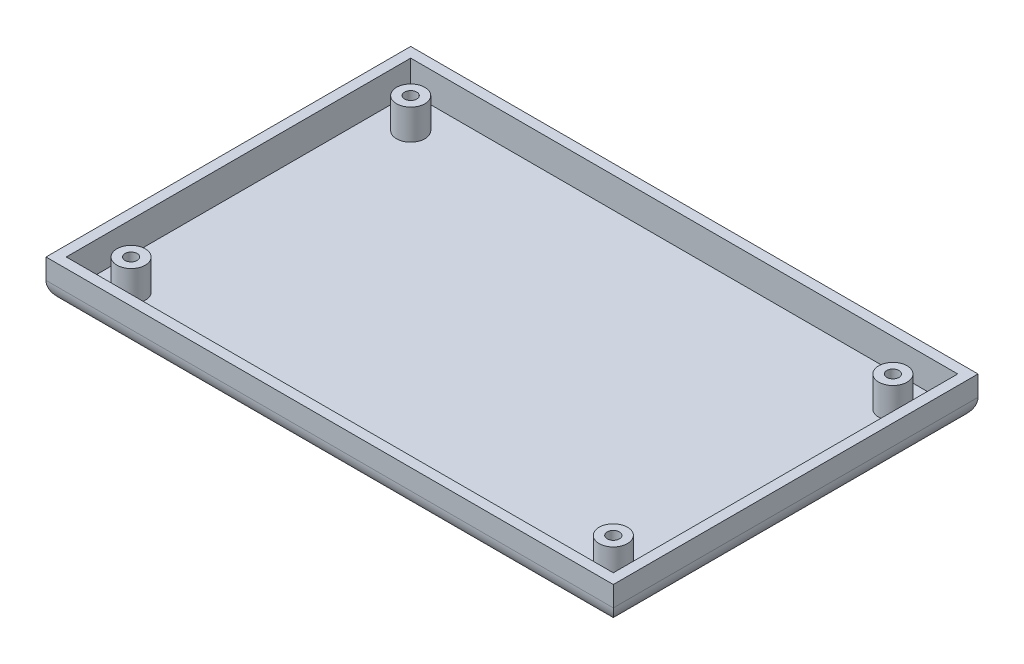
ISO-10303-21;
HEADER;
FILE_DESCRIPTION(('STEP AP214'),'2;1');
FILE_NAME('part.step','',(''),(''),'','','');
FILE_SCHEMA(('AUTOMOTIVE_DESIGN { 1 0 10303 214 1 1 1 1 }'));
ENDSEC;
DATA;
#1=APPLICATION_CONTEXT('core data for automotive mechanical design processes');
#2=APPLICATION_PROTOCOL_DEFINITION('international standard','automotive_design',2000,#1);
#3=PRODUCT_CONTEXT('',#1,'mechanical');
#4=PRODUCT('Part','Part','',(#3));
#5=PRODUCT_RELATED_PRODUCT_CATEGORY('part','',(#4));
#6=PRODUCT_DEFINITION_FORMATION('','',#4);
#7=PRODUCT_DEFINITION_CONTEXT('part definition',#1,'design');
#8=PRODUCT_DEFINITION('design','',#6,#7);
#9=PRODUCT_DEFINITION_SHAPE('','',#8);
#10=(LENGTH_UNIT() NAMED_UNIT(*) SI_UNIT(.MILLI.,.METRE.));
#11=(NAMED_UNIT(*) PLANE_ANGLE_UNIT() SI_UNIT($,.RADIAN.));
#12=(NAMED_UNIT(*) SI_UNIT($,.STERADIAN.) SOLID_ANGLE_UNIT());
#13=UNCERTAINTY_MEASURE_WITH_UNIT(LENGTH_MEASURE(1.E-05),#10,'distance_accuracy_value','');
#14=(GEOMETRIC_REPRESENTATION_CONTEXT(3) GLOBAL_UNCERTAINTY_ASSIGNED_CONTEXT((#13)) GLOBAL_UNIT_ASSIGNED_CONTEXT((#10,
#11,#12)) REPRESENTATION_CONTEXT('',''));
#15=CARTESIAN_POINT('',(0.,0.,0.));
#16=DIRECTION('',(0.,0.,1.));
#17=DIRECTION('',(1.,0.,0.));
#18=AXIS2_PLACEMENT_3D('',#15,#16,#17);
#19=CARTESIAN_POINT('',(0.,10.,0.));
#20=DIRECTION('',(1.,0.,0.));
#21=DIRECTION('',(0.,0.,-1.));
#22=AXIS2_PLACEMENT_3D('',#19,#20,#21);
#23=PLANE('',#22);
#24=DIRECTION('',(0.,-1.,0.));
#25=VECTOR('',#24,1.);
#26=CARTESIAN_POINT('',(0.,10.,-90.));
#27=LINE('',#26,#25);
#28=CARTESIAN_POINT('',(0.,10.,-90.));
#29=VERTEX_POINT('',#28);
#30=CARTESIAN_POINT('',(0.,5.,-90.));
#31=VERTEX_POINT('',#30);
#32=EDGE_CURVE('E226',#29,#31,#27,.T.);
#33=ORIENTED_EDGE('',*,*,#32,.T.);
#34=DIRECTION('',(0.,0.,1.));
#35=VECTOR('',#34,1.);
#36=CARTESIAN_POINT('',(0.,5.,0.));
#37=LINE('',#36,#35);
#38=CARTESIAN_POINT('',(0.,5.,0.));
#39=VERTEX_POINT('',#38);
#40=EDGE_CURVE('E101',#31,#39,#37,.T.);
#41=ORIENTED_EDGE('',*,*,#40,.T.);
#42=DIRECTION('',(0.,-1.,0.));
#43=VECTOR('',#42,1.);
#44=CARTESIAN_POINT('',(0.,10.,0.));
#45=LINE('',#44,#43);
#46=CARTESIAN_POINT('',(0.,10.,0.));
#47=VERTEX_POINT('',#46);
#48=EDGE_CURVE('E233',#47,#39,#45,.T.);
#49=ORIENTED_EDGE('',*,*,#48,.F.);
#50=DIRECTION('',(0.,0.,1.));
#51=VECTOR('',#50,1.);
#52=CARTESIAN_POINT('',(0.,10.,0.));
#53=LINE('',#52,#51);
#54=EDGE_CURVE('E214',#29,#47,#53,.T.);
#55=ORIENTED_EDGE('',*,*,#54,.F.);
#56=EDGE_LOOP('',(#33,#41,#49,#55));
#57=FACE_BOUND('',#56,.T.);
#58=ADVANCED_FACE('F92',(#57),#23,.F.);
#59=CARTESIAN_POINT('',(0.,10.,0.));
#60=DIRECTION('',(0.,0.,-1.));
#61=DIRECTION('',(-1.,0.,0.));
#62=AXIS2_PLACEMENT_3D('',#59,#60,#61);
#63=PLANE('',#62);
#64=ORIENTED_EDGE('',*,*,#48,.T.);
#65=DIRECTION('',(1.,0.,0.));
#66=VECTOR('',#65,1.);
#67=CARTESIAN_POINT('',(140.,5.,0.));
#68=LINE('',#67,#66);
#69=CARTESIAN_POINT('',(140.,5.,0.));
#70=VERTEX_POINT('',#69);
#71=EDGE_CURVE('E247',#39,#70,#68,.T.);
#72=ORIENTED_EDGE('',*,*,#71,.T.);
#73=DIRECTION('',(0.,-1.,0.));
#74=VECTOR('',#73,1.);
#75=CARTESIAN_POINT('',(140.,10.,0.));
#76=LINE('',#75,#74);
#77=CARTESIAN_POINT('',(140.,10.,0.));
#78=VERTEX_POINT('',#77);
#79=EDGE_CURVE('E230',#78,#70,#76,.T.);
#80=ORIENTED_EDGE('',*,*,#79,.F.);
#81=DIRECTION('',(1.,0.,0.));
#82=VECTOR('',#81,1.);
#83=CARTESIAN_POINT('',(0.,10.,0.));
#84=LINE('',#83,#82);
#85=EDGE_CURVE('E220',#47,#78,#84,.T.);
#86=ORIENTED_EDGE('',*,*,#85,.F.);
#87=EDGE_LOOP('',(#64,#72,#80,#86));
#88=FACE_BOUND('',#87,.T.);
#89=ADVANCED_FACE('F322',(#88),#63,.F.);
#90=CARTESIAN_POINT('',(140.,10.,0.));
#91=DIRECTION('',(-1.,0.,0.));
#92=DIRECTION('',(0.,0.,1.));
#93=AXIS2_PLACEMENT_3D('',#90,#91,#92);
#94=PLANE('',#93);
#95=ORIENTED_EDGE('',*,*,#79,.T.);
#96=DIRECTION('',(0.,0.,-1.));
#97=VECTOR('',#96,1.);
#98=CARTESIAN_POINT('',(140.,5.,-90.));
#99=LINE('',#98,#97);
#100=CARTESIAN_POINT('',(140.,5.,-90.));
#101=VERTEX_POINT('',#100);
#102=EDGE_CURVE('E235',#70,#101,#99,.T.);
#103=ORIENTED_EDGE('',*,*,#102,.T.);
#104=DIRECTION('',(0.,-1.,0.));
#105=VECTOR('',#104,1.);
#106=CARTESIAN_POINT('',(140.,10.,-90.));
#107=LINE('',#106,#105);
#108=CARTESIAN_POINT('',(140.,10.,-90.));
#109=VERTEX_POINT('',#108);
#110=EDGE_CURVE('E228',#109,#101,#107,.T.);
#111=ORIENTED_EDGE('',*,*,#110,.F.);
#112=DIRECTION('',(0.,0.,-1.));
#113=VECTOR('',#112,1.);
#114=CARTESIAN_POINT('',(140.,10.,0.));
#115=LINE('',#114,#113);
#116=EDGE_CURVE('E222',#78,#109,#115,.T.);
#117=ORIENTED_EDGE('',*,*,#116,.F.);
#118=EDGE_LOOP('',(#95,#103,#111,#117));
#119=FACE_BOUND('',#118,.T.);
#120=ADVANCED_FACE('F327',(#119),#94,.F.);
#121=CARTESIAN_POINT('',(0.,10.,-90.));
#122=DIRECTION('',(0.,0.,1.));
#123=DIRECTION('',(1.,0.,0.));
#124=AXIS2_PLACEMENT_3D('',#121,#122,#123);
#125=PLANE('',#124);
#126=ORIENTED_EDGE('',*,*,#110,.T.);
#127=DIRECTION('',(-1.,0.,0.));
#128=VECTOR('',#127,1.);
#129=CARTESIAN_POINT('',(0.,5.,-90.));
#130=LINE('',#129,#128);
#131=EDGE_CURVE('E12',#101,#31,#130,.T.);
#132=ORIENTED_EDGE('',*,*,#131,.T.);
#133=ORIENTED_EDGE('',*,*,#32,.F.);
#134=DIRECTION('',(-1.,0.,0.));
#135=VECTOR('',#134,1.);
#136=CARTESIAN_POINT('',(0.,10.,-90.));
#137=LINE('',#136,#135);
#138=EDGE_CURVE('E224',#109,#29,#137,.T.);
#139=ORIENTED_EDGE('',*,*,#138,.F.);
#140=EDGE_LOOP('',(#126,#132,#133,#139));
#141=FACE_BOUND('',#140,.T.);
#142=ADVANCED_FACE('F367',(#141),#125,.F.);
#143=CARTESIAN_POINT('',(0.,10.,0.));
#144=DIRECTION('',(0.,-1.,0.));
#145=DIRECTION('',(0.,0.,-1.));
#146=AXIS2_PLACEMENT_3D('',#143,#144,#145);
#147=PLANE('',#146);
#148=DIRECTION('',(-1.,0.,0.));
#149=VECTOR('',#148,1.);
#150=CARTESIAN_POINT('',(2.5,10.,-87.5));
#151=LINE('',#150,#149);
#152=CARTESIAN_POINT('',(137.5,10.,-87.5));
#153=VERTEX_POINT('',#152);
#154=CARTESIAN_POINT('',(2.5,10.,-87.5));
#155=VERTEX_POINT('',#154);
#156=EDGE_CURVE('E207',#153,#155,#151,.T.);
#157=ORIENTED_EDGE('',*,*,#156,.F.);
#158=DIRECTION('',(0.,0.,-1.));
#159=VECTOR('',#158,1.);
#160=CARTESIAN_POINT('',(137.5,10.,-87.5));
#161=LINE('',#160,#159);
#162=CARTESIAN_POINT('',(137.5,10.,-2.50000000000001));
#163=VERTEX_POINT('',#162);
#164=EDGE_CURVE('E178',#163,#153,#161,.T.);
#165=ORIENTED_EDGE('',*,*,#164,.F.);
#166=DIRECTION('',(1.,0.,0.));
#167=VECTOR('',#166,1.);
#168=CARTESIAN_POINT('',(2.5,10.,-2.50000000000001));
#169=LINE('',#168,#167);
#170=CARTESIAN_POINT('',(2.5,10.,-2.50000000000001));
#171=VERTEX_POINT('',#170);
#172=EDGE_CURVE('E195',#171,#163,#169,.T.);
#173=ORIENTED_EDGE('',*,*,#172,.F.);
#174=DIRECTION('',(0.,0.,1.));
#175=VECTOR('',#174,1.);
#176=CARTESIAN_POINT('',(2.5,10.,-87.5));
#177=LINE('',#176,#175);
#178=EDGE_CURVE('E198',#155,#171,#177,.T.);
#179=ORIENTED_EDGE('',*,*,#178,.F.);
#180=EDGE_LOOP('',(#157,#165,#173,#179));
#181=FACE_BOUND('',#180,.T.);
#182=ORIENTED_EDGE('',*,*,#54,.T.);
#183=ORIENTED_EDGE('',*,*,#85,.T.);
#184=ORIENTED_EDGE('',*,*,#116,.T.);
#185=ORIENTED_EDGE('',*,*,#138,.T.);
#186=EDGE_LOOP('',(#182,#183,#184,#185));
#187=FACE_BOUND('',#186,.T.);
#188=ADVANCED_FACE('F365',(#181,#187),#147,.F.);
#189=CARTESIAN_POINT('',(0.,0.,0.));
#190=DIRECTION('',(0.,-1.,0.));
#191=DIRECTION('',(0.,0.,-1.));
#192=AXIS2_PLACEMENT_3D('',#189,#190,#191);
#193=PLANE('',#192);
#194=DIRECTION('',(-1.,0.,0.));
#195=VECTOR('',#194,1.);
#196=CARTESIAN_POINT('',(140.,0.,-85.));
#197=LINE('',#196,#195);
#198=CARTESIAN_POINT('',(5.,0.,-85.));
#199=VERTEX_POINT('',#198);
#200=CARTESIAN_POINT('',(135.,0.,-85.));
#201=VERTEX_POINT('',#200);
#202=EDGE_CURVE('E238',#199,#201,#197,.F.);
#203=ORIENTED_EDGE('',*,*,#202,.T.);
#204=DIRECTION('',(0.,0.,-1.));
#205=VECTOR('',#204,1.);
#206=CARTESIAN_POINT('',(135.,0.,0.));
#207=LINE('',#206,#205);
#208=CARTESIAN_POINT('',(135.,0.,-5.));
#209=VERTEX_POINT('',#208);
#210=EDGE_CURVE('E244',#201,#209,#207,.F.);
#211=ORIENTED_EDGE('',*,*,#210,.T.);
#212=DIRECTION('',(1.,0.,0.));
#213=VECTOR('',#212,1.);
#214=CARTESIAN_POINT('',(0.,0.,-5.));
#215=LINE('',#214,#213);
#216=CARTESIAN_POINT('',(5.,0.,-5.));
#217=VERTEX_POINT('',#216);
#218=EDGE_CURVE('E242',#209,#217,#215,.F.);
#219=ORIENTED_EDGE('',*,*,#218,.T.);
#220=DIRECTION('',(0.,0.,1.));
#221=VECTOR('',#220,1.);
#222=CARTESIAN_POINT('',(5.,0.,-90.));
#223=LINE('',#222,#221);
#224=EDGE_CURVE('E240',#217,#199,#223,.F.);
#225=ORIENTED_EDGE('',*,*,#224,.T.);
#226=EDGE_LOOP('',(#203,#211,#219,#225));
#227=FACE_BOUND('',#226,.T.);
#228=CARTESIAN_POINT('',(129.5,0.,-10.5));
#229=DIRECTION('',(0.,1.,0.));
#230=DIRECTION('',(0.,0.,1.));
#231=AXIS2_PLACEMENT_3D('',#228,#229,#230);
#232=CIRCLE('',#231,1.49999999999997);
#233=CARTESIAN_POINT('',(129.5,0.,-9.00000000000004));
#234=VERTEX_POINT('',#233);
#235=EDGE_CURVE('E265',#234,#234,#232,.T.);
#236=ORIENTED_EDGE('',*,*,#235,.T.);
#237=EDGE_LOOP('',(#236));
#238=FACE_BOUND('',#237,.T.);
#239=CARTESIAN_POINT('',(129.5,0.,-79.5));
#240=DIRECTION('',(0.,1.,0.));
#241=DIRECTION('',(0.,0.,1.));
#242=AXIS2_PLACEMENT_3D('',#239,#240,#241);
#243=CIRCLE('',#242,1.49999999999997);
#244=CARTESIAN_POINT('',(129.5,0.,-78.));
#245=VERTEX_POINT('',#244);
#246=EDGE_CURVE('E592',#245,#245,#243,.T.);
#247=ORIENTED_EDGE('',*,*,#246,.T.);
#248=EDGE_LOOP('',(#247));
#249=FACE_BOUND('',#248,.T.);
#250=CARTESIAN_POINT('',(10.5,0.,-79.5));
#251=DIRECTION('',(0.,1.,0.));
#252=DIRECTION('',(0.,0.,1.));
#253=AXIS2_PLACEMENT_3D('',#250,#251,#252);
#254=CIRCLE('',#253,1.5);
#255=CARTESIAN_POINT('',(10.5,0.,-78.));
#256=VERTEX_POINT('',#255);
#257=EDGE_CURVE('E281',#256,#256,#254,.T.);
#258=ORIENTED_EDGE('',*,*,#257,.T.);
#259=EDGE_LOOP('',(#258));
#260=FACE_BOUND('',#259,.T.);
#261=CARTESIAN_POINT('',(10.5,0.,-10.5));
#262=DIRECTION('',(0.,1.,0.));
#263=DIRECTION('',(0.,0.,1.));
#264=AXIS2_PLACEMENT_3D('',#261,#262,#263);
#265=CIRCLE('',#264,1.5);
#266=CARTESIAN_POINT('',(10.5,0.,-9.00000000000001));
#267=VERTEX_POINT('',#266);
#268=EDGE_CURVE('E274',#267,#267,#265,.T.);
#269=ORIENTED_EDGE('',*,*,#268,.T.);
#270=EDGE_LOOP('',(#269));
#271=FACE_BOUND('',#270,.T.);
#272=ADVANCED_FACE('F355',(#227,#238,#249,#260,#271),#193,.T.);
#273=CARTESIAN_POINT('',(137.5,2.5,-87.5));
#274=DIRECTION('',(1.,0.,0.));
#275=DIRECTION('',(0.,0.,-1.));
#276=AXIS2_PLACEMENT_3D('',#273,#274,#275);
#277=PLANE('',#276);
#278=ORIENTED_EDGE('',*,*,#164,.T.);
#279=DIRECTION('',(0.,1.,0.));
#280=VECTOR('',#279,1.);
#281=CARTESIAN_POINT('',(137.5,2.5,-87.5));
#282=LINE('',#281,#280);
#283=CARTESIAN_POINT('',(137.5,2.5,-87.5));
#284=VERTEX_POINT('',#283);
#285=EDGE_CURVE('E171',#284,#153,#282,.T.);
#286=ORIENTED_EDGE('',*,*,#285,.F.);
#287=DIRECTION('',(0.,0.,-1.));
#288=VECTOR('',#287,1.);
#289=CARTESIAN_POINT('',(137.5,2.5,-87.5));
#290=LINE('',#289,#288);
#291=CARTESIAN_POINT('',(137.5,2.5,-2.50000000000001));
#292=VERTEX_POINT('',#291);
#293=EDGE_CURVE('E175',#292,#284,#290,.T.);
#294=ORIENTED_EDGE('',*,*,#293,.F.);
#295=DIRECTION('',(0.,1.,0.));
#296=VECTOR('',#295,1.);
#297=CARTESIAN_POINT('',(137.5,2.5,-2.50000000000001));
#298=LINE('',#297,#296);
#299=EDGE_CURVE('E212',#292,#163,#298,.T.);
#300=ORIENTED_EDGE('',*,*,#299,.T.);
#301=EDGE_LOOP('',(#278,#286,#294,#300));
#302=FACE_BOUND('',#301,.T.);
#303=ADVANCED_FACE('F173',(#302),#277,.F.);
#304=CARTESIAN_POINT('',(2.5,2.5,-2.50000000000001));
#305=DIRECTION('',(0.,0.,1.));
#306=DIRECTION('',(1.,0.,0.));
#307=AXIS2_PLACEMENT_3D('',#304,#305,#306);
#308=PLANE('',#307);
#309=ORIENTED_EDGE('',*,*,#172,.T.);
#310=ORIENTED_EDGE('',*,*,#299,.F.);
#311=DIRECTION('',(1.,0.,0.));
#312=VECTOR('',#311,1.);
#313=CARTESIAN_POINT('',(2.5,2.5,-2.50000000000001));
#314=LINE('',#313,#312);
#315=CARTESIAN_POINT('',(2.5,2.5,-2.50000000000001));
#316=VERTEX_POINT('',#315);
#317=EDGE_CURVE('E183',#316,#292,#314,.T.);
#318=ORIENTED_EDGE('',*,*,#317,.F.);
#319=DIRECTION('',(0.,1.,0.));
#320=VECTOR('',#319,1.);
#321=CARTESIAN_POINT('',(2.5,2.5,-2.50000000000001));
#322=LINE('',#321,#320);
#323=EDGE_CURVE('E215',#316,#171,#322,.T.);
#324=ORIENTED_EDGE('',*,*,#323,.T.);
#325=EDGE_LOOP('',(#309,#310,#318,#324));
#326=FACE_BOUND('',#325,.T.);
#327=ADVANCED_FACE('F380',(#326),#308,.F.);
#328=CARTESIAN_POINT('',(2.5,2.5,-87.5));
#329=DIRECTION('',(-1.,0.,0.));
#330=DIRECTION('',(0.,0.,1.));
#331=AXIS2_PLACEMENT_3D('',#328,#329,#330);
#332=PLANE('',#331);
#333=ORIENTED_EDGE('',*,*,#178,.T.);
#334=ORIENTED_EDGE('',*,*,#323,.F.);
#335=DIRECTION('',(0.,0.,1.));
#336=VECTOR('',#335,1.);
#337=CARTESIAN_POINT('',(2.5,2.5,-87.5));
#338=LINE('',#337,#336);
#339=CARTESIAN_POINT('',(2.5,2.5,-87.5));
#340=VERTEX_POINT('',#339);
#341=EDGE_CURVE('E191',#340,#316,#338,.T.);
#342=ORIENTED_EDGE('',*,*,#341,.F.);
#343=DIRECTION('',(0.,1.,0.));
#344=VECTOR('',#343,1.);
#345=CARTESIAN_POINT('',(2.5,2.5,-87.5));
#346=LINE('',#345,#344);
#347=EDGE_CURVE('E182',#340,#155,#346,.T.);
#348=ORIENTED_EDGE('',*,*,#347,.T.);
#349=EDGE_LOOP('',(#333,#334,#342,#348));
#350=FACE_BOUND('',#349,.T.);
#351=ADVANCED_FACE('F316',(#350),#332,.F.);
#352=CARTESIAN_POINT('',(2.5,2.5,-87.5));
#353=DIRECTION('',(0.,0.,-1.));
#354=DIRECTION('',(-1.,0.,0.));
#355=AXIS2_PLACEMENT_3D('',#352,#353,#354);
#356=PLANE('',#355);
#357=ORIENTED_EDGE('',*,*,#156,.T.);
#358=ORIENTED_EDGE('',*,*,#347,.F.);
#359=DIRECTION('',(-1.,0.,0.));
#360=VECTOR('',#359,1.);
#361=CARTESIAN_POINT('',(2.5,2.5,-87.5));
#362=LINE('',#361,#360);
#363=EDGE_CURVE('E186',#284,#340,#362,.T.);
#364=ORIENTED_EDGE('',*,*,#363,.F.);
#365=ORIENTED_EDGE('',*,*,#285,.T.);
#366=EDGE_LOOP('',(#357,#358,#364,#365));
#367=FACE_BOUND('',#366,.T.);
#368=ADVANCED_FACE('F187',(#367),#356,.F.);
#369=CARTESIAN_POINT('',(0.,2.5,0.));
#370=DIRECTION('',(0.,1.,0.));
#371=DIRECTION('',(0.,0.,1.));
#372=AXIS2_PLACEMENT_3D('',#369,#370,#371);
#373=PLANE('',#372);
#374=CARTESIAN_POINT('',(129.5,2.5,-79.5));
#375=DIRECTION('',(0.,1.,0.));
#376=DIRECTION('',(0.,0.,1.));
#377=AXIS2_PLACEMENT_3D('',#374,#375,#376);
#378=CIRCLE('',#377,3.49999999999999);
#379=CARTESIAN_POINT('',(129.5,2.5,-76.));
#380=VERTEX_POINT('',#379);
#381=EDGE_CURVE('E277',#380,#380,#378,.T.);
#382=ORIENTED_EDGE('',*,*,#381,.F.);
#383=EDGE_LOOP('',(#382));
#384=FACE_BOUND('',#383,.T.);
#385=CARTESIAN_POINT('',(129.5,2.5,-10.5));
#386=DIRECTION('',(0.,1.,0.));
#387=DIRECTION('',(0.,0.,1.));
#388=AXIS2_PLACEMENT_3D('',#385,#386,#387);
#389=CIRCLE('',#388,3.49999999999999);
#390=CARTESIAN_POINT('',(129.5,2.5,-7.00000000000002));
#391=VERTEX_POINT('',#390);
#392=EDGE_CURVE('E285',#391,#391,#389,.T.);
#393=ORIENTED_EDGE('',*,*,#392,.F.);
#394=EDGE_LOOP('',(#393));
#395=FACE_BOUND('',#394,.T.);
#396=CARTESIAN_POINT('',(10.5,2.5,-10.5));
#397=DIRECTION('',(0.,1.,0.));
#398=DIRECTION('',(0.,0.,1.));
#399=AXIS2_PLACEMENT_3D('',#396,#397,#398);
#400=CIRCLE('',#399,3.5);
#401=CARTESIAN_POINT('',(10.5,2.5,-7.00000000000001));
#402=VERTEX_POINT('',#401);
#403=EDGE_CURVE('E291',#402,#402,#400,.T.);
#404=ORIENTED_EDGE('',*,*,#403,.F.);
#405=EDGE_LOOP('',(#404));
#406=FACE_BOUND('',#405,.T.);
#407=CARTESIAN_POINT('',(10.5,2.5,-79.5));
#408=DIRECTION('',(0.,1.,0.));
#409=DIRECTION('',(0.,0.,1.));
#410=AXIS2_PLACEMENT_3D('',#407,#408,#409);
#411=CIRCLE('',#410,3.5);
#412=CARTESIAN_POINT('',(10.5,2.5,-76.));
#413=VERTEX_POINT('',#412);
#414=EDGE_CURVE('E201',#413,#413,#411,.T.);
#415=ORIENTED_EDGE('',*,*,#414,.F.);
#416=EDGE_LOOP('',(#415));
#417=FACE_BOUND('',#416,.T.);
#418=ORIENTED_EDGE('',*,*,#293,.T.);
#419=ORIENTED_EDGE('',*,*,#363,.T.);
#420=ORIENTED_EDGE('',*,*,#341,.T.);
#421=ORIENTED_EDGE('',*,*,#317,.T.);
#422=EDGE_LOOP('',(#418,#419,#420,#421));
#423=FACE_BOUND('',#422,.T.);
#424=ADVANCED_FACE('F193',(#384,#395,#406,#417,#423),#373,.T.);
#425=CARTESIAN_POINT('',(10.5,10.,-79.5));
#426=DIRECTION('',(0.,-1.,0.));
#427=DIRECTION('',(0.,0.,-1.));
#428=AXIS2_PLACEMENT_3D('',#425,#426,#427);
#429=CYLINDRICAL_SURFACE('',#428,3.5);
#430=CARTESIAN_POINT('',(10.5,10.,-79.5));
#431=DIRECTION('',(0.,1.,0.));
#432=DIRECTION('',(0.,0.,1.));
#433=AXIS2_PLACEMENT_3D('',#430,#431,#432);
#434=CIRCLE('',#433,3.5);
#435=CARTESIAN_POINT('',(10.5,10.,-76.));
#436=VERTEX_POINT('',#435);
#437=EDGE_CURVE('E208',#436,#436,#434,.T.);
#438=ORIENTED_EDGE('',*,*,#437,.F.);
#439=EDGE_LOOP('',(#438));
#440=FACE_BOUND('',#439,.T.);
#441=ORIENTED_EDGE('',*,*,#414,.T.);
#442=EDGE_LOOP('',(#441));
#443=FACE_BOUND('',#442,.T.);
#444=ADVANCED_FACE('F304',(#440,#443),#429,.T.);
#445=CARTESIAN_POINT('',(10.5,10.,-79.5));
#446=DIRECTION('',(0.,1.,0.));
#447=DIRECTION('',(0.,0.,1.));
#448=AXIS2_PLACEMENT_3D('',#445,#446,#447);
#449=PLANE('',#448);
#450=CARTESIAN_POINT('',(10.5,10.,-79.5));
#451=DIRECTION('',(0.,1.,0.));
#452=DIRECTION('',(0.,0.,1.));
#453=AXIS2_PLACEMENT_3D('',#450,#451,#452);
#454=CIRCLE('',#453,1.5);
#455=CARTESIAN_POINT('',(10.5,10.,-78.));
#456=VERTEX_POINT('',#455);
#457=EDGE_CURVE('E595',#456,#456,#454,.T.);
#458=ORIENTED_EDGE('',*,*,#457,.F.);
#459=EDGE_LOOP('',(#458));
#460=FACE_BOUND('',#459,.T.);
#461=ORIENTED_EDGE('',*,*,#437,.T.);
#462=EDGE_LOOP('',(#461));
#463=FACE_BOUND('',#462,.T.);
#464=ADVANCED_FACE('F313',(#460,#463),#449,.T.);
#465=CARTESIAN_POINT('',(10.5,10.,-10.5));
#466=DIRECTION('',(0.,-1.,0.));
#467=DIRECTION('',(0.,0.,-1.));
#468=AXIS2_PLACEMENT_3D('',#465,#466,#467);
#469=CYLINDRICAL_SURFACE('',#468,3.5);
#470=CARTESIAN_POINT('',(10.5,10.,-10.5));
#471=DIRECTION('',(0.,1.,0.));
#472=DIRECTION('',(0.,0.,1.));
#473=AXIS2_PLACEMENT_3D('',#470,#471,#472);
#474=CIRCLE('',#473,3.5);
#475=CARTESIAN_POINT('',(10.5,10.,-7.00000000000001));
#476=VERTEX_POINT('',#475);
#477=EDGE_CURVE('E294',#476,#476,#474,.T.);
#478=ORIENTED_EDGE('',*,*,#477,.F.);
#479=EDGE_LOOP('',(#478));
#480=FACE_BOUND('',#479,.T.);
#481=ORIENTED_EDGE('',*,*,#403,.T.);
#482=EDGE_LOOP('',(#481));
#483=FACE_BOUND('',#482,.T.);
#484=ADVANCED_FACE('F417',(#480,#483),#469,.T.);
#485=CARTESIAN_POINT('',(10.5,10.,-10.5));
#486=DIRECTION('',(0.,1.,0.));
#487=DIRECTION('',(0.,0.,1.));
#488=AXIS2_PLACEMENT_3D('',#485,#486,#487);
#489=PLANE('',#488);
#490=CARTESIAN_POINT('',(10.5,10.,-10.5));
#491=DIRECTION('',(0.,1.,0.));
#492=DIRECTION('',(0.,0.,1.));
#493=AXIS2_PLACEMENT_3D('',#490,#491,#492);
#494=CIRCLE('',#493,1.5);
#495=CARTESIAN_POINT('',(10.5,10.,-9.00000000000001));
#496=VERTEX_POINT('',#495);
#497=EDGE_CURVE('E278',#496,#496,#494,.T.);
#498=ORIENTED_EDGE('',*,*,#497,.F.);
#499=EDGE_LOOP('',(#498));
#500=FACE_BOUND('',#499,.T.);
#501=ORIENTED_EDGE('',*,*,#477,.T.);
#502=EDGE_LOOP('',(#501));
#503=FACE_BOUND('',#502,.T.);
#504=ADVANCED_FACE('F422',(#500,#503),#489,.T.);
#505=CARTESIAN_POINT('',(129.5,10.,-10.5));
#506=DIRECTION('',(0.,-1.,0.));
#507=DIRECTION('',(0.,0.,-1.));
#508=AXIS2_PLACEMENT_3D('',#505,#506,#507);
#509=CYLINDRICAL_SURFACE('',#508,3.49999999999999);
#510=CARTESIAN_POINT('',(129.5,10.,-10.5));
#511=DIRECTION('',(0.,1.,0.));
#512=DIRECTION('',(0.,0.,1.));
#513=AXIS2_PLACEMENT_3D('',#510,#511,#512);
#514=CIRCLE('',#513,3.49999999999999);
#515=CARTESIAN_POINT('',(129.5,10.,-7.00000000000002));
#516=VERTEX_POINT('',#515);
#517=EDGE_CURVE('E288',#516,#516,#514,.T.);
#518=ORIENTED_EDGE('',*,*,#517,.F.);
#519=EDGE_LOOP('',(#518));
#520=FACE_BOUND('',#519,.T.);
#521=ORIENTED_EDGE('',*,*,#392,.T.);
#522=EDGE_LOOP('',(#521));
#523=FACE_BOUND('',#522,.T.);
#524=ADVANCED_FACE('F430',(#520,#523),#509,.T.);
#525=CARTESIAN_POINT('',(129.5,10.,-10.5));
#526=DIRECTION('',(0.,1.,0.));
#527=DIRECTION('',(0.,0.,1.));
#528=AXIS2_PLACEMENT_3D('',#525,#526,#527);
#529=PLANE('',#528);
#530=CARTESIAN_POINT('',(129.5,10.,-10.5));
#531=DIRECTION('',(0.,1.,0.));
#532=DIRECTION('',(0.,0.,1.));
#533=AXIS2_PLACEMENT_3D('',#530,#531,#532);
#534=CIRCLE('',#533,1.49999999999997);
#535=CARTESIAN_POINT('',(129.5,10.,-9.00000000000004));
#536=VERTEX_POINT('',#535);
#537=EDGE_CURVE('E259',#536,#536,#534,.T.);
#538=ORIENTED_EDGE('',*,*,#537,.F.);
#539=EDGE_LOOP('',(#538));
#540=FACE_BOUND('',#539,.T.);
#541=ORIENTED_EDGE('',*,*,#517,.T.);
#542=EDGE_LOOP('',(#541));
#543=FACE_BOUND('',#542,.T.);
#544=ADVANCED_FACE('F435',(#540,#543),#529,.T.);
#545=CARTESIAN_POINT('',(129.5,10.,-79.5));
#546=DIRECTION('',(0.,-1.,0.));
#547=DIRECTION('',(0.,0.,-1.));
#548=AXIS2_PLACEMENT_3D('',#545,#546,#547);
#549=CYLINDRICAL_SURFACE('',#548,3.49999999999999);
#550=CARTESIAN_POINT('',(129.5,10.,-79.5));
#551=DIRECTION('',(0.,1.,0.));
#552=DIRECTION('',(0.,0.,1.));
#553=AXIS2_PLACEMENT_3D('',#550,#551,#552);
#554=CIRCLE('',#553,3.49999999999999);
#555=CARTESIAN_POINT('',(129.5,10.,-76.));
#556=VERTEX_POINT('',#555);
#557=EDGE_CURVE('E282',#556,#556,#554,.T.);
#558=ORIENTED_EDGE('',*,*,#557,.F.);
#559=EDGE_LOOP('',(#558));
#560=FACE_BOUND('',#559,.T.);
#561=ORIENTED_EDGE('',*,*,#381,.T.);
#562=EDGE_LOOP('',(#561));
#563=FACE_BOUND('',#562,.T.);
#564=ADVANCED_FACE('F443',(#560,#563),#549,.T.);
#565=CARTESIAN_POINT('',(129.5,10.,-79.5));
#566=DIRECTION('',(0.,1.,0.));
#567=DIRECTION('',(0.,0.,1.));
#568=AXIS2_PLACEMENT_3D('',#565,#566,#567);
#569=PLANE('',#568);
#570=CARTESIAN_POINT('',(129.5,10.,-79.5));
#571=DIRECTION('',(0.,1.,0.));
#572=DIRECTION('',(0.,0.,1.));
#573=AXIS2_PLACEMENT_3D('',#570,#571,#572);
#574=CIRCLE('',#573,1.49999999999997);
#575=CARTESIAN_POINT('',(129.5,10.,-78.));
#576=VERTEX_POINT('',#575);
#577=EDGE_CURVE('E270',#576,#576,#574,.T.);
#578=ORIENTED_EDGE('',*,*,#577,.F.);
#579=EDGE_LOOP('',(#578));
#580=FACE_BOUND('',#579,.T.);
#581=ORIENTED_EDGE('',*,*,#557,.T.);
#582=EDGE_LOOP('',(#581));
#583=FACE_BOUND('',#582,.T.);
#584=ADVANCED_FACE('F448',(#580,#583),#569,.T.);
#585=CARTESIAN_POINT('',(129.5,0.,-79.5));
#586=DIRECTION('',(0.,1.,0.));
#587=DIRECTION('',(0.,0.,1.));
#588=AXIS2_PLACEMENT_3D('',#585,#586,#587);
#589=CYLINDRICAL_SURFACE('',#588,1.49999999999997);
#590=ORIENTED_EDGE('',*,*,#246,.F.);
#591=EDGE_LOOP('',(#590));
#592=FACE_BOUND('',#591,.T.);
#593=ORIENTED_EDGE('',*,*,#577,.T.);
#594=EDGE_LOOP('',(#593));
#595=FACE_BOUND('',#594,.T.);
#596=ADVANCED_FACE('F479',(#592,#595),#589,.F.);
#597=CARTESIAN_POINT('',(129.5,0.,-10.5));
#598=DIRECTION('',(0.,1.,0.));
#599=DIRECTION('',(0.,0.,1.));
#600=AXIS2_PLACEMENT_3D('',#597,#598,#599);
#601=CYLINDRICAL_SURFACE('',#600,1.49999999999997);
#602=ORIENTED_EDGE('',*,*,#235,.F.);
#603=EDGE_LOOP('',(#602));
#604=FACE_BOUND('',#603,.T.);
#605=ORIENTED_EDGE('',*,*,#537,.T.);
#606=EDGE_LOOP('',(#605));
#607=FACE_BOUND('',#606,.T.);
#608=ADVANCED_FACE('F489',(#604,#607),#601,.F.);
#609=CARTESIAN_POINT('',(10.5,0.,-10.5));
#610=DIRECTION('',(0.,1.,0.));
#611=DIRECTION('',(0.,0.,1.));
#612=AXIS2_PLACEMENT_3D('',#609,#610,#611);
#613=CYLINDRICAL_SURFACE('',#612,1.5);
#614=ORIENTED_EDGE('',*,*,#268,.F.);
#615=EDGE_LOOP('',(#614));
#616=FACE_BOUND('',#615,.T.);
#617=ORIENTED_EDGE('',*,*,#497,.T.);
#618=EDGE_LOOP('',(#617));
#619=FACE_BOUND('',#618,.T.);
#620=ADVANCED_FACE('F348',(#616,#619),#613,.F.);
#621=CARTESIAN_POINT('',(10.5,0.,-79.5));
#622=DIRECTION('',(0.,1.,0.));
#623=DIRECTION('',(0.,0.,1.));
#624=AXIS2_PLACEMENT_3D('',#621,#622,#623);
#625=CYLINDRICAL_SURFACE('',#624,1.5);
#626=ORIENTED_EDGE('',*,*,#257,.F.);
#627=EDGE_LOOP('',(#626));
#628=FACE_BOUND('',#627,.T.);
#629=ORIENTED_EDGE('',*,*,#457,.T.);
#630=EDGE_LOOP('',(#629));
#631=FACE_BOUND('',#630,.T.);
#632=ADVANCED_FACE('F343',(#628,#631),#625,.F.);
#633=CARTESIAN_POINT('',(5.,5.,0.));
#634=DIRECTION('',(0.,0.,-1.));
#635=DIRECTION('',(-1.,0.,0.));
#636=AXIS2_PLACEMENT_3D('',#633,#634,#635);
#637=CYLINDRICAL_SURFACE('',#636,5.);
#638=CARTESIAN_POINT('',(5.,5.,-85.));
#639=DIRECTION('',(0.707106781186547,0.,-0.707106781186547));
#640=DIRECTION('',(0.707106781186547,0.,0.707106781186547));
#641=AXIS2_PLACEMENT_3D('',#638,#639,#640);
#642=ELLIPSE('',#641,7.07106781186547,5.);
#643=EDGE_CURVE('E253',#199,#31,#642,.T.);
#644=ORIENTED_EDGE('',*,*,#643,.F.);
#645=ORIENTED_EDGE('',*,*,#224,.F.);
#646=CARTESIAN_POINT('',(5.,5.,-5.));
#647=DIRECTION('',(-0.707106781186547,0.,-0.707106781186547));
#648=DIRECTION('',(0.707106781186547,0.,-0.707106781186547));
#649=AXIS2_PLACEMENT_3D('',#646,#647,#648);
#650=ELLIPSE('',#649,7.07106781186547,5.);
#651=EDGE_CURVE('E96',#39,#217,#650,.F.);
#652=ORIENTED_EDGE('',*,*,#651,.F.);
#653=ORIENTED_EDGE('',*,*,#40,.F.);
#654=EDGE_LOOP('',(#644,#645,#652,#653));
#655=FACE_BOUND('',#654,.T.);
#656=ADVANCED_FACE('F94',(#655),#637,.T.);
#657=CARTESIAN_POINT('',(0.,5.,-5.));
#658=DIRECTION('',(-1.,0.,0.));
#659=DIRECTION('',(0.,0.,1.));
#660=AXIS2_PLACEMENT_3D('',#657,#658,#659);
#661=CYLINDRICAL_SURFACE('',#660,5.);
#662=ORIENTED_EDGE('',*,*,#651,.T.);
#663=ORIENTED_EDGE('',*,*,#218,.F.);
#664=CARTESIAN_POINT('',(135.,5.,-5.));
#665=DIRECTION('',(-0.707106781186547,0.,0.707106781186547));
#666=DIRECTION('',(-0.707106781186547,0.,-0.707106781186547));
#667=AXIS2_PLACEMENT_3D('',#664,#665,#666);
#668=ELLIPSE('',#667,7.07106781186547,5.);
#669=EDGE_CURVE('E252',#70,#209,#668,.F.);
#670=ORIENTED_EDGE('',*,*,#669,.F.);
#671=ORIENTED_EDGE('',*,*,#71,.F.);
#672=EDGE_LOOP('',(#662,#663,#670,#671));
#673=FACE_BOUND('',#672,.T.);
#674=ADVANCED_FACE('F338',(#673),#661,.T.);
#675=CARTESIAN_POINT('',(0.,5.,-85.));
#676=DIRECTION('',(1.,0.,0.));
#677=DIRECTION('',(0.,0.,-1.));
#678=AXIS2_PLACEMENT_3D('',#675,#676,#677);
#679=CYLINDRICAL_SURFACE('',#678,5.);
#680=ORIENTED_EDGE('',*,*,#643,.T.);
#681=ORIENTED_EDGE('',*,*,#131,.F.);
#682=CARTESIAN_POINT('',(135.,5.,-85.));
#683=DIRECTION('',(0.707106781186547,0.,0.707106781186547));
#684=DIRECTION('',(0.707106781186547,0.,-0.707106781186547));
#685=AXIS2_PLACEMENT_3D('',#682,#683,#684);
#686=ELLIPSE('',#685,7.07106781186547,5.);
#687=EDGE_CURVE('E250',#201,#101,#686,.T.);
#688=ORIENTED_EDGE('',*,*,#687,.F.);
#689=ORIENTED_EDGE('',*,*,#202,.F.);
#690=EDGE_LOOP('',(#680,#681,#688,#689));
#691=FACE_BOUND('',#690,.T.);
#692=ADVANCED_FACE('F335',(#691),#679,.T.);
#693=CARTESIAN_POINT('',(135.,5.,0.));
#694=DIRECTION('',(0.,0.,1.));
#695=DIRECTION('',(1.,0.,0.));
#696=AXIS2_PLACEMENT_3D('',#693,#694,#695);
#697=CYLINDRICAL_SURFACE('',#696,5.);
#698=ORIENTED_EDGE('',*,*,#669,.T.);
#699=ORIENTED_EDGE('',*,*,#210,.F.);
#700=ORIENTED_EDGE('',*,*,#687,.T.);
#701=ORIENTED_EDGE('',*,*,#102,.F.);
#702=EDGE_LOOP('',(#698,#699,#700,#701));
#703=FACE_BOUND('',#702,.T.);
#704=ADVANCED_FACE('F332',(#703),#697,.T.);
#705=CLOSED_SHELL('',(#58,#89,#120,#142,#188,#272,#303,#327,#351,#368,#424,#444,#464,#484,#504,
#524,#544,#564,#584,#596,#608,#620,#632,#656,#674,#692,#704));
#706=MANIFOLD_SOLID_BREP('B2',#705);
#707=ADVANCED_BREP_SHAPE_REPRESENTATION('',(#18,#706),#14);
#708=SHAPE_DEFINITION_REPRESENTATION(#9,#707);
ENDSEC;
END-ISO-10303-21;
